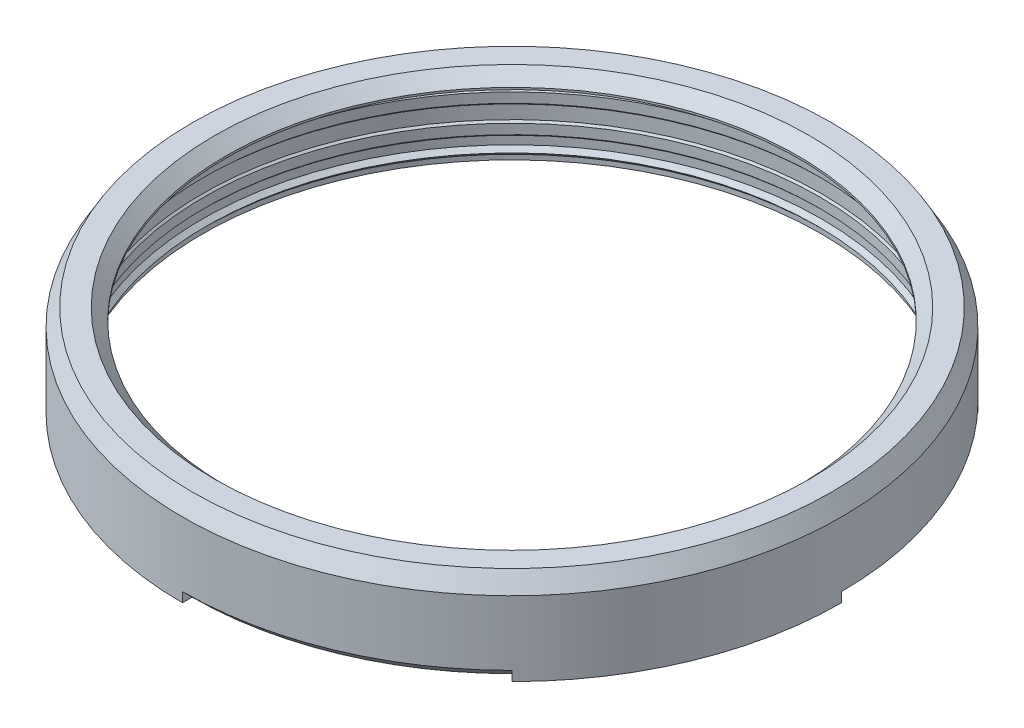
ISO-10303-21;
HEADER;
FILE_DESCRIPTION(('STEP AP214'),'2;1');
FILE_NAME('part.step','',(''),(''),'','','');
FILE_SCHEMA(('AUTOMOTIVE_DESIGN { 1 0 10303 214 1 1 1 1 }'));
ENDSEC;
DATA;
#1=APPLICATION_CONTEXT('core data for automotive mechanical design processes');
#2=APPLICATION_PROTOCOL_DEFINITION('international standard','automotive_design',2000,#1);
#3=PRODUCT_CONTEXT('',#1,'mechanical');
#4=PRODUCT('Part','Part','',(#3));
#5=PRODUCT_RELATED_PRODUCT_CATEGORY('part','',(#4));
#6=PRODUCT_DEFINITION_FORMATION('','',#4);
#7=PRODUCT_DEFINITION_CONTEXT('part definition',#1,'design');
#8=PRODUCT_DEFINITION('design','',#6,#7);
#9=PRODUCT_DEFINITION_SHAPE('','',#8);
#10=(LENGTH_UNIT() NAMED_UNIT(*) SI_UNIT(.MILLI.,.METRE.));
#11=(NAMED_UNIT(*) PLANE_ANGLE_UNIT() SI_UNIT($,.RADIAN.));
#12=(NAMED_UNIT(*) SI_UNIT($,.STERADIAN.) SOLID_ANGLE_UNIT());
#13=UNCERTAINTY_MEASURE_WITH_UNIT(LENGTH_MEASURE(1.E-05),#10,'distance_accuracy_value','');
#14=(GEOMETRIC_REPRESENTATION_CONTEXT(3) GLOBAL_UNCERTAINTY_ASSIGNED_CONTEXT((#13)) GLOBAL_UNIT_ASSIGNED_CONTEXT((#10,
#11,#12)) REPRESENTATION_CONTEXT('',''));
#15=CARTESIAN_POINT('',(0.,0.,0.));
#16=DIRECTION('',(0.,0.,1.));
#17=DIRECTION('',(1.,0.,0.));
#18=AXIS2_PLACEMENT_3D('',#15,#16,#17);
#19=CARTESIAN_POINT('',(0.,-1.39999999999982,0.));
#20=DIRECTION('',(0.,-1.,0.));
#21=DIRECTION('',(0.,0.,-1.));
#22=AXIS2_PLACEMENT_3D('',#19,#20,#21);
#23=TOROIDAL_SURFACE('',#22,30.5300000000001,1.39999999999978);
#24=CARTESIAN_POINT('',(0.,-1.39999999999982,0.));
#25=DIRECTION('',(0.,-1.,0.));
#26=DIRECTION('',(0.,0.,-1.));
#27=AXIS2_PLACEMENT_3D('',#24,#25,#26);
#28=CIRCLE('',#27,31.9299999999999);
#29=CARTESIAN_POINT('',(0.,-1.39999999999982,-31.9299999999999));
#30=VERTEX_POINT('',#29);
#31=EDGE_CURVE('E260',#30,#30,#28,.T.);
#32=ORIENTED_EDGE('',*,*,#31,.T.);
#33=EDGE_LOOP('',(#32));
#34=FACE_BOUND('',#33,.T.);
#35=CARTESIAN_POINT('',(0.,-0.0225022686044193,0.));
#36=DIRECTION('',(0.,-1.,0.));
#37=DIRECTION('',(0.,0.,-1.));
#38=AXIS2_PLACEMENT_3D('',#35,#36,#37);
#39=CIRCLE('',#38,30.78);
#40=CARTESIAN_POINT('',(0.,-0.0225022686044193,-30.78));
#41=VERTEX_POINT('',#40);
#42=EDGE_CURVE('E43',#41,#41,#39,.F.);
#43=ORIENTED_EDGE('',*,*,#42,.T.);
#44=EDGE_LOOP('',(#43));
#45=FACE_BOUND('',#44,.T.);
#46=ADVANCED_FACE('F38',(#34,#45),#23,.F.);
#47=CARTESIAN_POINT('',(0.,0.,0.));
#48=DIRECTION('',(0.,1.,0.));
#49=DIRECTION('',(0.,0.,1.));
#50=AXIS2_PLACEMENT_3D('',#47,#48,#49);
#51=PLANE('',#50);
#52=CARTESIAN_POINT('',(0.,0.,0.));
#53=DIRECTION('',(0.,1.,0.));
#54=DIRECTION('',(0.,0.,1.));
#55=AXIS2_PLACEMENT_3D('',#52,#53,#54);
#56=CIRCLE('',#55,29.5);
#57=CARTESIAN_POINT('',(0.,0.,29.5));
#58=VERTEX_POINT('',#57);
#59=EDGE_CURVE('E218',#58,#58,#56,.T.);
#60=ORIENTED_EDGE('',*,*,#59,.T.);
#61=EDGE_LOOP('',(#60));
#62=FACE_BOUND('',#61,.T.);
#63=CARTESIAN_POINT('',(0.,0.,0.));
#64=DIRECTION('',(0.,-1.,0.));
#65=DIRECTION('',(0.,0.,-1.));
#66=AXIS2_PLACEMENT_3D('',#63,#64,#65);
#67=CIRCLE('',#66,30.32);
#68=CARTESIAN_POINT('',(0.,0.,-30.32));
#69=VERTEX_POINT('',#68);
#70=EDGE_CURVE('E572',#69,#69,#67,.T.);
#71=ORIENTED_EDGE('',*,*,#70,.T.);
#72=EDGE_LOOP('',(#71));
#73=FACE_BOUND('',#72,.T.);
#74=ADVANCED_FACE('F291',(#62,#73),#51,.F.);
#75=CARTESIAN_POINT('',(0.,2.,0.));
#76=DIRECTION('',(0.,-1.,0.));
#77=DIRECTION('',(0.,0.,-1.));
#78=AXIS2_PLACEMENT_3D('',#75,#76,#77);
#79=CYLINDRICAL_SURFACE('',#78,34.);
#80=CARTESIAN_POINT('',(0.,-0.332000000000018,0.));
#81=DIRECTION('',(0.,1.,0.));
#82=DIRECTION('',(0.,0.,1.));
#83=AXIS2_PLACEMENT_3D('',#80,#81,#82);
#84=CIRCLE('',#83,34.);
#85=CARTESIAN_POINT('',(0.,-0.332000000000018,-34.));
#86=VERTEX_POINT('',#85);
#87=EDGE_CURVE('E268',#86,#86,#84,.F.);
#88=ORIENTED_EDGE('',*,*,#87,.T.);
#89=EDGE_LOOP('',(#88));
#90=FACE_BOUND('',#89,.T.);
#91=DIRECTION('',(0.,1.,0.));
#92=VECTOR('',#91,1.);
#93=CARTESIAN_POINT('',(-24.0416305603427,-7.99999999999999,-24.0416305603425));
#94=LINE('',#93,#92);
#95=CARTESIAN_POINT('',(-24.0416305603427,-7.99999999999999,-24.0416305603425));
#96=VERTEX_POINT('',#95);
#97=CARTESIAN_POINT('',(-24.0416305603427,-6.99999999999999,-24.0416305603425));
#98=VERTEX_POINT('',#97);
#99=EDGE_CURVE('E148',#96,#98,#94,.T.);
#100=ORIENTED_EDGE('',*,*,#99,.F.);
#101=CARTESIAN_POINT('',(0.,-7.99999999999999,0.));
#102=DIRECTION('',(0.,-1.,0.));
#103=DIRECTION('',(0.,0.,-1.));
#104=AXIS2_PLACEMENT_3D('',#101,#102,#103);
#105=CIRCLE('',#104,33.9999999999998);
#106=CARTESIAN_POINT('',(-33.9999999999998,-7.99999999999999,0.));
#107=VERTEX_POINT('',#106);
#108=EDGE_CURVE('E323',#107,#96,#105,.T.);
#109=ORIENTED_EDGE('',*,*,#108,.F.);
#110=DIRECTION('',(0.,1.,0.));
#111=VECTOR('',#110,1.);
#112=CARTESIAN_POINT('',(-34.,-7.99999999999999,0.));
#113=LINE('',#112,#111);
#114=CARTESIAN_POINT('',(-34.,-6.99999999999999,0.));
#115=VERTEX_POINT('',#114);
#116=EDGE_CURVE('E63',#107,#115,#113,.T.);
#117=ORIENTED_EDGE('',*,*,#116,.T.);
#118=CARTESIAN_POINT('',(0.,-6.99999999999999,0.));
#119=DIRECTION('',(0.,-1.,0.));
#120=DIRECTION('',(0.,0.,1.));
#121=AXIS2_PLACEMENT_3D('',#118,#119,#120);
#122=CIRCLE('',#121,34.);
#123=CARTESIAN_POINT('',(-24.0416305603426,-6.99999999999999,24.0416305603427));
#124=VERTEX_POINT('',#123);
#125=EDGE_CURVE('E166',#124,#115,#122,.T.);
#126=ORIENTED_EDGE('',*,*,#125,.F.);
#127=DIRECTION('',(0.,1.,0.));
#128=VECTOR('',#127,1.);
#129=CARTESIAN_POINT('',(-24.0416305603426,-7.99999999999999,24.0416305603427));
#130=LINE('',#129,#128);
#131=CARTESIAN_POINT('',(-24.0416305603426,-7.99999999999999,24.0416305603427));
#132=VERTEX_POINT('',#131);
#133=EDGE_CURVE('E134',#132,#124,#130,.T.);
#134=ORIENTED_EDGE('',*,*,#133,.F.);
#135=CARTESIAN_POINT('',(3.56493298585568E-13,-7.99999999999999,33.9999999999998));
#136=VERTEX_POINT('',#135);
#137=EDGE_CURVE('E223',#136,#132,#105,.T.);
#138=ORIENTED_EDGE('',*,*,#137,.F.);
#139=DIRECTION('',(0.,1.,0.));
#140=VECTOR('',#139,1.);
#141=CARTESIAN_POINT('',(3.56131096562E-13,-7.99999999999999,34.));
#142=LINE('',#141,#140);
#143=CARTESIAN_POINT('',(3.56131096562E-13,-6.99999999999999,34.));
#144=VERTEX_POINT('',#143);
#145=EDGE_CURVE('E182',#136,#144,#142,.T.);
#146=ORIENTED_EDGE('',*,*,#145,.T.);
#147=CARTESIAN_POINT('',(0.,-6.99999999999999,0.));
#148=DIRECTION('',(0.,-1.,0.));
#149=DIRECTION('',(1.,0.,0.));
#150=AXIS2_PLACEMENT_3D('',#147,#148,#149);
#151=CIRCLE('',#150,34.);
#152=CARTESIAN_POINT('',(24.0416305603429,-6.99999999999999,24.0416305603423));
#153=VERTEX_POINT('',#152);
#154=EDGE_CURVE('E187',#153,#144,#151,.T.);
#155=ORIENTED_EDGE('',*,*,#154,.F.);
#156=DIRECTION('',(0.,1.,0.));
#157=VECTOR('',#156,1.);
#158=CARTESIAN_POINT('',(24.0416305603429,-7.99999999999999,24.0416305603423));
#159=LINE('',#158,#157);
#160=CARTESIAN_POINT('',(24.0416305603429,-7.99999999999999,24.0416305603423));
#161=VERTEX_POINT('',#160);
#162=EDGE_CURVE('E160',#161,#153,#159,.T.);
#163=ORIENTED_EDGE('',*,*,#162,.F.);
#164=CARTESIAN_POINT('',(33.9999999999998,-7.99999999999999,0.));
#165=VERTEX_POINT('',#164);
#166=EDGE_CURVE('E219',#165,#161,#105,.T.);
#167=ORIENTED_EDGE('',*,*,#166,.F.);
#168=DIRECTION('',(0.,1.,0.));
#169=VECTOR('',#168,1.);
#170=CARTESIAN_POINT('',(34.,-7.99999999999999,0.));
#171=LINE('',#170,#169);
#172=CARTESIAN_POINT('',(34.,-6.99999999999999,0.));
#173=VERTEX_POINT('',#172);
#174=EDGE_CURVE('E199',#165,#173,#171,.T.);
#175=ORIENTED_EDGE('',*,*,#174,.T.);
#176=CARTESIAN_POINT('',(0.,-6.99999999999999,0.));
#177=DIRECTION('',(0.,-1.,0.));
#178=DIRECTION('',(0.,0.,-1.));
#179=AXIS2_PLACEMENT_3D('',#176,#177,#178);
#180=CIRCLE('',#179,34.);
#181=CARTESIAN_POINT('',(24.0416305603426,-6.99999999999999,-24.0416305603427));
#182=VERTEX_POINT('',#181);
#183=EDGE_CURVE('E216',#182,#173,#180,.T.);
#184=ORIENTED_EDGE('',*,*,#183,.F.);
#185=DIRECTION('',(0.,1.,0.));
#186=VECTOR('',#185,1.);
#187=CARTESIAN_POINT('',(24.0416305603426,-7.99999999999999,-24.0416305603427));
#188=LINE('',#187,#186);
#189=CARTESIAN_POINT('',(24.0416305603426,-7.99999999999999,-24.0416305603427));
#190=VERTEX_POINT('',#189);
#191=EDGE_CURVE('E208',#190,#182,#188,.T.);
#192=ORIENTED_EDGE('',*,*,#191,.F.);
#193=CARTESIAN_POINT('',(-1.17433149195491E-13,-7.99999999999999,-33.9999999999998));
#194=VERTEX_POINT('',#193);
#195=EDGE_CURVE('E224',#194,#190,#105,.T.);
#196=ORIENTED_EDGE('',*,*,#195,.F.);
#197=DIRECTION('',(0.,1.,0.));
#198=VECTOR('',#197,1.);
#199=CARTESIAN_POINT('',(-1.18710365520667E-13,-7.99999999999999,-34.));
#200=LINE('',#199,#198);
#201=CARTESIAN_POINT('',(-1.18710365520667E-13,-6.99999999999999,-34.));
#202=VERTEX_POINT('',#201);
#203=EDGE_CURVE('E55',#194,#202,#200,.T.);
#204=ORIENTED_EDGE('',*,*,#203,.T.);
#205=CARTESIAN_POINT('',(0.,-6.99999999999999,0.));
#206=DIRECTION('',(0.,-1.,0.));
#207=DIRECTION('',(-1.,0.,0.));
#208=AXIS2_PLACEMENT_3D('',#205,#206,#207);
#209=CIRCLE('',#208,34.);
#210=EDGE_CURVE('E142',#98,#202,#209,.T.);
#211=ORIENTED_EDGE('',*,*,#210,.F.);
#212=EDGE_LOOP('',(#100,#109,#117,#126,#134,#138,#146,#155,#163,#167,#175,#184,#192,#196,#204,#211));
#213=FACE_BOUND('',#212,.T.);
#214=ADVANCED_FACE('F299',(#90,#213),#79,.T.);
#215=CARTESIAN_POINT('',(16.9999999999999,-7.99999999999999,29.4448637286708));
#216=DIRECTION('',(0.,-1.,0.));
#217=DIRECTION('',(0.,0.,-1.));
#218=AXIS2_PLACEMENT_3D('',#215,#216,#217);
#219=PLANE('',#218);
#220=CARTESIAN_POINT('',(0.,-7.99999999999999,0.));
#221=DIRECTION('',(0.,-1.,0.));
#222=DIRECTION('',(0.,0.,-1.));
#223=AXIS2_PLACEMENT_3D('',#220,#221,#222);
#224=CIRCLE('',#223,31.9299999999999);
#225=CARTESIAN_POINT('',(0.,-7.99999999999999,-31.9299999999999));
#226=VERTEX_POINT('',#225);
#227=EDGE_CURVE('E222',#226,#226,#224,.T.);
#228=ORIENTED_EDGE('',*,*,#227,.F.);
#229=EDGE_LOOP('',(#228));
#230=FACE_BOUND('',#229,.T.);
#231=ORIENTED_EDGE('',*,*,#108,.T.);
#232=DIRECTION('',(-0.707106781186551,0.,-0.707106781186544));
#233=VECTOR('',#232,1.);
#234=CARTESIAN_POINT('',(-23.3345237791562,-7.99999999999999,-23.334523779156));
#235=LINE('',#234,#233);
#236=CARTESIAN_POINT('',(-23.3345237791562,-7.99999999999999,-23.334523779156));
#237=VERTEX_POINT('',#236);
#238=EDGE_CURVE('E146',#237,#96,#235,.T.);
#239=ORIENTED_EDGE('',*,*,#238,.F.);
#240=CARTESIAN_POINT('',(0.,-7.99999999999999,0.));
#241=DIRECTION('',(0.,-1.,0.));
#242=DIRECTION('',(-1.,0.,0.));
#243=AXIS2_PLACEMENT_3D('',#240,#241,#242);
#244=CIRCLE('',#243,33.);
#245=CARTESIAN_POINT('',(-1.15218884181823E-13,-7.99999999999999,-33.));
#246=VERTEX_POINT('',#245);
#247=EDGE_CURVE('E139',#237,#246,#244,.T.);
#248=ORIENTED_EDGE('',*,*,#247,.T.);
#249=DIRECTION('',(0.,0.,-1.));
#250=VECTOR('',#249,1.);
#251=CARTESIAN_POINT('',(-1.15218884181823E-13,-7.99999999999999,-33.));
#252=LINE('',#251,#250);
#253=EDGE_CURVE('E126',#246,#194,#252,.T.);
#254=ORIENTED_EDGE('',*,*,#253,.T.);
#255=ORIENTED_EDGE('',*,*,#195,.T.);
#256=DIRECTION('',(0.707106781186546,0.,-0.707106781186549));
#257=VECTOR('',#256,1.);
#258=CARTESIAN_POINT('',(23.334523779156,-7.99999999999999,-23.3345237791561));
#259=LINE('',#258,#257);
#260=CARTESIAN_POINT('',(23.334523779156,-7.99999999999999,-23.3345237791561));
#261=VERTEX_POINT('',#260);
#262=EDGE_CURVE('E205',#261,#190,#259,.T.);
#263=ORIENTED_EDGE('',*,*,#262,.F.);
#264=CARTESIAN_POINT('',(0.,-7.99999999999999,0.));
#265=DIRECTION('',(0.,-1.,0.));
#266=DIRECTION('',(0.,0.,-1.));
#267=AXIS2_PLACEMENT_3D('',#264,#265,#266);
#268=CIRCLE('',#267,33.);
#269=CARTESIAN_POINT('',(33.,-7.99999999999999,0.));
#270=VERTEX_POINT('',#269);
#271=EDGE_CURVE('E213',#261,#270,#268,.T.);
#272=ORIENTED_EDGE('',*,*,#271,.T.);
#273=DIRECTION('',(1.,0.,0.));
#274=VECTOR('',#273,1.);
#275=CARTESIAN_POINT('',(33.,-7.99999999999999,0.));
#276=LINE('',#275,#274);
#277=EDGE_CURVE('E156',#270,#165,#276,.T.);
#278=ORIENTED_EDGE('',*,*,#277,.T.);
#279=ORIENTED_EDGE('',*,*,#166,.T.);
#280=DIRECTION('',(0.707106781186556,0.,0.707106781186539));
#281=VECTOR('',#280,1.);
#282=CARTESIAN_POINT('',(23.3345237791564,-7.99999999999999,23.3345237791558));
#283=LINE('',#282,#281);
#284=CARTESIAN_POINT('',(23.3345237791564,-7.99999999999999,23.3345237791558));
#285=VERTEX_POINT('',#284);
#286=EDGE_CURVE('E193',#285,#161,#283,.T.);
#287=ORIENTED_EDGE('',*,*,#286,.F.);
#288=CARTESIAN_POINT('',(0.,-7.99999999999999,0.));
#289=DIRECTION('',(0.,-1.,0.));
#290=DIRECTION('',(1.,0.,0.));
#291=AXIS2_PLACEMENT_3D('',#288,#289,#290);
#292=CIRCLE('',#291,33.);
#293=CARTESIAN_POINT('',(3.4565665254547E-13,-7.99999999999999,33.));
#294=VERTEX_POINT('',#293);
#295=EDGE_CURVE('E190',#285,#294,#292,.T.);
#296=ORIENTED_EDGE('',*,*,#295,.T.);
#297=DIRECTION('',(0.,0.,1.));
#298=VECTOR('',#297,1.);
#299=CARTESIAN_POINT('',(3.4565665254547E-13,-7.99999999999999,33.));
#300=LINE('',#299,#298);
#301=EDGE_CURVE('E176',#294,#136,#300,.T.);
#302=ORIENTED_EDGE('',*,*,#301,.T.);
#303=ORIENTED_EDGE('',*,*,#137,.T.);
#304=DIRECTION('',(-0.707106781186546,0.,0.707106781186549));
#305=VECTOR('',#304,1.);
#306=CARTESIAN_POINT('',(-23.334523779156,-7.99999999999999,23.3345237791561));
#307=LINE('',#306,#305);
#308=CARTESIAN_POINT('',(-23.334523779156,-7.99999999999999,23.3345237791561));
#309=VERTEX_POINT('',#308);
#310=EDGE_CURVE('E172',#309,#132,#307,.T.);
#311=ORIENTED_EDGE('',*,*,#310,.F.);
#312=CARTESIAN_POINT('',(0.,-7.99999999999999,0.));
#313=DIRECTION('',(0.,-1.,0.));
#314=DIRECTION('',(0.,0.,1.));
#315=AXIS2_PLACEMENT_3D('',#312,#313,#314);
#316=CIRCLE('',#315,33.);
#317=CARTESIAN_POINT('',(-33.,-7.99999999999999,0.));
#318=VERTEX_POINT('',#317);
#319=EDGE_CURVE('E169',#309,#318,#316,.T.);
#320=ORIENTED_EDGE('',*,*,#319,.T.);
#321=DIRECTION('',(-1.,0.,0.));
#322=VECTOR('',#321,1.);
#323=CARTESIAN_POINT('',(-33.,-7.99999999999999,0.));
#324=LINE('',#323,#322);
#325=EDGE_CURVE('E157',#318,#107,#324,.T.);
#326=ORIENTED_EDGE('',*,*,#325,.T.);
#327=EDGE_LOOP('',(#231,#239,#248,#254,#255,#263,#272,#278,#279,#287,#296,#302,#303,#311,#320,#326));
#328=FACE_BOUND('',#327,.T.);
#329=ADVANCED_FACE('F145',(#230,#328),#219,.T.);
#330=CARTESIAN_POINT('',(0.,-7.99999999999999,0.));
#331=DIRECTION('',(0.,1.,0.));
#332=DIRECTION('',(0.,0.,1.));
#333=AXIS2_PLACEMENT_3D('',#330,#331,#332);
#334=CYLINDRICAL_SURFACE('',#333,29.5);
#335=CARTESIAN_POINT('',(0.,0.199999999999997,0.));
#336=DIRECTION('',(0.,1.,0.));
#337=DIRECTION('',(0.,0.,1.));
#338=AXIS2_PLACEMENT_3D('',#335,#336,#337);
#339=CIRCLE('',#338,29.5);
#340=CARTESIAN_POINT('',(0.,0.199999999999997,29.5));
#341=VERTEX_POINT('',#340);
#342=EDGE_CURVE('E11',#341,#341,#339,.T.);
#343=ORIENTED_EDGE('',*,*,#342,.T.);
#344=EDGE_LOOP('',(#343));
#345=FACE_BOUND('',#344,.T.);
#346=ORIENTED_EDGE('',*,*,#59,.F.);
#347=EDGE_LOOP('',(#346));
#348=FACE_BOUND('',#347,.T.);
#349=ADVANCED_FACE('F316',(#345,#348),#334,.F.);
#350=CARTESIAN_POINT('',(0.,0.,0.));
#351=DIRECTION('',(0.,-1.,0.));
#352=DIRECTION('',(0.,0.,-1.));
#353=AXIS2_PLACEMENT_3D('',#350,#351,#352);
#354=CYLINDRICAL_SURFACE('',#353,31.9299999999999);
#355=CARTESIAN_POINT('',(0.,-1.5999999999996,0.));
#356=DIRECTION('',(0.,-1.,0.));
#357=DIRECTION('',(0.,0.,-1.));
#358=AXIS2_PLACEMENT_3D('',#355,#356,#357);
#359=CIRCLE('',#358,31.9299999999999);
#360=CARTESIAN_POINT('',(0.,-1.5999999999996,-31.9299999999999));
#361=VERTEX_POINT('',#360);
#362=EDGE_CURVE('E257',#361,#361,#359,.T.);
#363=ORIENTED_EDGE('',*,*,#362,.T.);
#364=EDGE_LOOP('',(#363));
#365=FACE_BOUND('',#364,.T.);
#366=ORIENTED_EDGE('',*,*,#31,.F.);
#367=EDGE_LOOP('',(#366));
#368=FACE_BOUND('',#367,.T.);
#369=ADVANCED_FACE('F304',(#365,#368),#354,.F.);
#370=CARTESIAN_POINT('',(0.,-1.5999999999996,0.));
#371=DIRECTION('',(0.,1.,0.));
#372=DIRECTION('',(0.,0.,1.));
#373=AXIS2_PLACEMENT_3D('',#370,#371,#372);
#374=CONICAL_SURFACE('',#373,31.9299999999999,0.785398163397427);
#375=CARTESIAN_POINT('',(0.,-1.78999999999967,0.));
#376=DIRECTION('',(0.,-1.,0.));
#377=DIRECTION('',(0.,0.,-1.));
#378=AXIS2_PLACEMENT_3D('',#375,#376,#377);
#379=CIRCLE('',#378,31.7399999999999);
#380=CARTESIAN_POINT('',(0.,-1.78999999999967,-31.7399999999999));
#381=VERTEX_POINT('',#380);
#382=EDGE_CURVE('E254',#381,#381,#379,.T.);
#383=ORIENTED_EDGE('',*,*,#382,.T.);
#384=EDGE_LOOP('',(#383));
#385=FACE_BOUND('',#384,.T.);
#386=ORIENTED_EDGE('',*,*,#362,.F.);
#387=EDGE_LOOP('',(#386));
#388=FACE_BOUND('',#387,.T.);
#389=ADVANCED_FACE('F421',(#385,#388),#374,.F.);
#390=CARTESIAN_POINT('',(0.,0.,0.));
#391=DIRECTION('',(0.,-1.,0.));
#392=DIRECTION('',(0.,0.,-1.));
#393=AXIS2_PLACEMENT_3D('',#390,#391,#392);
#394=CYLINDRICAL_SURFACE('',#393,31.7399999999999);
#395=CARTESIAN_POINT('',(0.,-2.80999999999968,0.));
#396=DIRECTION('',(0.,-1.,0.));
#397=DIRECTION('',(0.,0.,-1.));
#398=AXIS2_PLACEMENT_3D('',#395,#396,#397);
#399=CIRCLE('',#398,31.7399999999999);
#400=CARTESIAN_POINT('',(0.,-2.80999999999968,-31.7399999999999));
#401=VERTEX_POINT('',#400);
#402=EDGE_CURVE('E251',#401,#401,#399,.T.);
#403=ORIENTED_EDGE('',*,*,#402,.T.);
#404=EDGE_LOOP('',(#403));
#405=FACE_BOUND('',#404,.T.);
#406=ORIENTED_EDGE('',*,*,#382,.F.);
#407=EDGE_LOOP('',(#406));
#408=FACE_BOUND('',#407,.T.);
#409=ADVANCED_FACE('F418',(#405,#408),#394,.F.);
#410=CARTESIAN_POINT('',(0.,-2.80999999999968,0.));
#411=DIRECTION('',(0.,-1.,0.));
#412=DIRECTION('',(0.,0.,-1.));
#413=AXIS2_PLACEMENT_3D('',#410,#411,#412);
#414=CONICAL_SURFACE('',#413,31.7399999999999,0.785398163397503);
#415=CARTESIAN_POINT('',(0.,-2.99999999999972,0.));
#416=DIRECTION('',(0.,-1.,0.));
#417=DIRECTION('',(0.,0.,-1.));
#418=AXIS2_PLACEMENT_3D('',#415,#416,#417);
#419=CIRCLE('',#418,31.9299999999999);
#420=CARTESIAN_POINT('',(0.,-2.99999999999972,-31.9299999999999));
#421=VERTEX_POINT('',#420);
#422=EDGE_CURVE('E248',#421,#421,#419,.T.);
#423=ORIENTED_EDGE('',*,*,#422,.T.);
#424=EDGE_LOOP('',(#423));
#425=FACE_BOUND('',#424,.T.);
#426=ORIENTED_EDGE('',*,*,#402,.F.);
#427=EDGE_LOOP('',(#426));
#428=FACE_BOUND('',#427,.T.);
#429=ADVANCED_FACE('F414',(#425,#428),#414,.F.);
#430=CARTESIAN_POINT('',(0.,0.,0.));
#431=DIRECTION('',(0.,-1.,0.));
#432=DIRECTION('',(0.,0.,-1.));
#433=AXIS2_PLACEMENT_3D('',#430,#431,#432);
#434=CYLINDRICAL_SURFACE('',#433,31.9299999999999);
#435=CARTESIAN_POINT('',(0.,-4.39999999999971,0.));
#436=DIRECTION('',(0.,-1.,0.));
#437=DIRECTION('',(0.,0.,-1.));
#438=AXIS2_PLACEMENT_3D('',#435,#436,#437);
#439=CIRCLE('',#438,31.9299999999999);
#440=CARTESIAN_POINT('',(0.,-4.39999999999971,-31.9299999999999));
#441=VERTEX_POINT('',#440);
#442=EDGE_CURVE('E245',#441,#441,#439,.T.);
#443=ORIENTED_EDGE('',*,*,#442,.T.);
#444=EDGE_LOOP('',(#443));
#445=FACE_BOUND('',#444,.T.);
#446=ORIENTED_EDGE('',*,*,#422,.F.);
#447=EDGE_LOOP('',(#446));
#448=FACE_BOUND('',#447,.T.);
#449=ADVANCED_FACE('F410',(#445,#448),#434,.F.);
#450=CARTESIAN_POINT('',(0.,-4.39999999999971,0.));
#451=DIRECTION('',(0.,1.,0.));
#452=DIRECTION('',(0.,0.,1.));
#453=AXIS2_PLACEMENT_3D('',#450,#451,#452);
#454=CONICAL_SURFACE('',#453,31.9299999999999,0.785398163397396);
#455=CARTESIAN_POINT('',(0.,-4.58999999999978,0.));
#456=DIRECTION('',(0.,-1.,0.));
#457=DIRECTION('',(0.,0.,-1.));
#458=AXIS2_PLACEMENT_3D('',#455,#456,#457);
#459=CIRCLE('',#458,31.7399999999999);
#460=CARTESIAN_POINT('',(0.,-4.58999999999978,-31.7399999999999));
#461=VERTEX_POINT('',#460);
#462=EDGE_CURVE('E242',#461,#461,#459,.T.);
#463=ORIENTED_EDGE('',*,*,#462,.T.);
#464=EDGE_LOOP('',(#463));
#465=FACE_BOUND('',#464,.T.);
#466=ORIENTED_EDGE('',*,*,#442,.F.);
#467=EDGE_LOOP('',(#466));
#468=FACE_BOUND('',#467,.T.);
#469=ADVANCED_FACE('F406',(#465,#468),#454,.F.);
#470=CARTESIAN_POINT('',(0.,0.,0.));
#471=DIRECTION('',(0.,-1.,0.));
#472=DIRECTION('',(0.,0.,-1.));
#473=AXIS2_PLACEMENT_3D('',#470,#471,#472);
#474=CYLINDRICAL_SURFACE('',#473,31.7399999999999);
#475=CARTESIAN_POINT('',(0.,-5.60999999999975,0.));
#476=DIRECTION('',(0.,-1.,0.));
#477=DIRECTION('',(0.,0.,-1.));
#478=AXIS2_PLACEMENT_3D('',#475,#476,#477);
#479=CIRCLE('',#478,31.7399999999999);
#480=CARTESIAN_POINT('',(0.,-5.60999999999975,-31.7399999999999));
#481=VERTEX_POINT('',#480);
#482=EDGE_CURVE('E239',#481,#481,#479,.T.);
#483=ORIENTED_EDGE('',*,*,#482,.T.);
#484=EDGE_LOOP('',(#483));
#485=FACE_BOUND('',#484,.T.);
#486=ORIENTED_EDGE('',*,*,#462,.F.);
#487=EDGE_LOOP('',(#486));
#488=FACE_BOUND('',#487,.T.);
#489=ADVANCED_FACE('F402',(#485,#488),#474,.F.);
#490=CARTESIAN_POINT('',(0.,-5.60999999999975,0.));
#491=DIRECTION('',(0.,-1.,0.));
#492=DIRECTION('',(0.,0.,-1.));
#493=AXIS2_PLACEMENT_3D('',#490,#491,#492);
#494=CONICAL_SURFACE('',#493,31.7399999999999,0.785398163397505);
#495=CARTESIAN_POINT('',(0.,-5.79999999999978,0.));
#496=DIRECTION('',(0.,-1.,0.));
#497=DIRECTION('',(0.,0.,-1.));
#498=AXIS2_PLACEMENT_3D('',#495,#496,#497);
#499=CIRCLE('',#498,31.9299999999999);
#500=CARTESIAN_POINT('',(0.,-5.79999999999978,-31.9299999999999));
#501=VERTEX_POINT('',#500);
#502=EDGE_CURVE('E236',#501,#501,#499,.T.);
#503=ORIENTED_EDGE('',*,*,#502,.T.);
#504=EDGE_LOOP('',(#503));
#505=FACE_BOUND('',#504,.T.);
#506=ORIENTED_EDGE('',*,*,#482,.F.);
#507=EDGE_LOOP('',(#506));
#508=FACE_BOUND('',#507,.T.);
#509=ADVANCED_FACE('F398',(#505,#508),#494,.F.);
#510=CARTESIAN_POINT('',(0.,0.,0.));
#511=DIRECTION('',(0.,-1.,0.));
#512=DIRECTION('',(0.,0.,-1.));
#513=AXIS2_PLACEMENT_3D('',#510,#511,#512);
#514=CYLINDRICAL_SURFACE('',#513,31.9299999999999);
#515=CARTESIAN_POINT('',(0.,-6.64999999999977,0.));
#516=DIRECTION('',(0.,-1.,0.));
#517=DIRECTION('',(0.,0.,-1.));
#518=AXIS2_PLACEMENT_3D('',#515,#516,#517);
#519=CIRCLE('',#518,31.9299999999999);
#520=CARTESIAN_POINT('',(0.,-6.64999999999977,-31.9299999999999));
#521=VERTEX_POINT('',#520);
#522=EDGE_CURVE('E233',#521,#521,#519,.T.);
#523=ORIENTED_EDGE('',*,*,#522,.T.);
#524=EDGE_LOOP('',(#523));
#525=FACE_BOUND('',#524,.T.);
#526=ORIENTED_EDGE('',*,*,#502,.F.);
#527=EDGE_LOOP('',(#526));
#528=FACE_BOUND('',#527,.T.);
#529=ADVANCED_FACE('F394',(#525,#528),#514,.F.);
#530=CARTESIAN_POINT('',(0.,-6.64999999999977,0.));
#531=DIRECTION('',(0.,1.,0.));
#532=DIRECTION('',(0.,0.,1.));
#533=AXIS2_PLACEMENT_3D('',#530,#531,#532);
#534=CONICAL_SURFACE('',#533,31.9299999999999,0.785398163397383);
#535=CARTESIAN_POINT('',(0.,-7.07499999999994,0.));
#536=DIRECTION('',(0.,-1.,0.));
#537=DIRECTION('',(0.,0.,-1.));
#538=AXIS2_PLACEMENT_3D('',#535,#536,#537);
#539=CIRCLE('',#538,31.5049999999998);
#540=CARTESIAN_POINT('',(0.,-7.07499999999994,-31.5049999999998));
#541=VERTEX_POINT('',#540);
#542=EDGE_CURVE('E230',#541,#541,#539,.T.);
#543=ORIENTED_EDGE('',*,*,#542,.T.);
#544=EDGE_LOOP('',(#543));
#545=FACE_BOUND('',#544,.T.);
#546=ORIENTED_EDGE('',*,*,#522,.F.);
#547=EDGE_LOOP('',(#546));
#548=FACE_BOUND('',#547,.T.);
#549=ADVANCED_FACE('F390',(#545,#548),#534,.F.);
#550=CARTESIAN_POINT('',(0.,-7.07499999999994,0.));
#551=DIRECTION('',(0.,-1.,0.));
#552=DIRECTION('',(0.,0.,-1.));
#553=AXIS2_PLACEMENT_3D('',#550,#551,#552);
#554=CONICAL_SURFACE('',#553,31.5049999999998,0.785398163397522);
#555=CARTESIAN_POINT('',(0.,-7.49999999999998,0.));
#556=DIRECTION('',(0.,-1.,0.));
#557=DIRECTION('',(0.,0.,-1.));
#558=AXIS2_PLACEMENT_3D('',#555,#556,#557);
#559=CIRCLE('',#558,31.9299999999999);
#560=CARTESIAN_POINT('',(0.,-7.49999999999998,-31.9299999999999));
#561=VERTEX_POINT('',#560);
#562=EDGE_CURVE('E227',#561,#561,#559,.T.);
#563=ORIENTED_EDGE('',*,*,#562,.T.);
#564=EDGE_LOOP('',(#563));
#565=FACE_BOUND('',#564,.T.);
#566=ORIENTED_EDGE('',*,*,#542,.F.);
#567=EDGE_LOOP('',(#566));
#568=FACE_BOUND('',#567,.T.);
#569=ADVANCED_FACE('F386',(#565,#568),#554,.F.);
#570=CARTESIAN_POINT('',(0.,0.,0.));
#571=DIRECTION('',(0.,-1.,0.));
#572=DIRECTION('',(0.,0.,-1.));
#573=AXIS2_PLACEMENT_3D('',#570,#571,#572);
#574=CYLINDRICAL_SURFACE('',#573,31.9299999999999);
#575=ORIENTED_EDGE('',*,*,#227,.T.);
#576=EDGE_LOOP('',(#575));
#577=FACE_BOUND('',#576,.T.);
#578=ORIENTED_EDGE('',*,*,#562,.F.);
#579=EDGE_LOOP('',(#578));
#580=FACE_BOUND('',#579,.T.);
#581=ADVANCED_FACE('F380',(#577,#580),#574,.F.);
#582=CARTESIAN_POINT('',(0.,1.4,0.));
#583=DIRECTION('',(0.,1.,0.));
#584=DIRECTION('',(0.,0.,1.));
#585=AXIS2_PLACEMENT_3D('',#582,#583,#584);
#586=PLANE('',#585);
#587=CARTESIAN_POINT('',(0.,1.4,0.));
#588=DIRECTION('',(0.,1.,0.));
#589=DIRECTION('',(0.,0.,1.));
#590=AXIS2_PLACEMENT_3D('',#587,#588,#589);
#591=CIRCLE('',#590,30.7);
#592=CARTESIAN_POINT('',(0.,1.4,30.7));
#593=VERTEX_POINT('',#592);
#594=EDGE_CURVE('E48',#593,#593,#591,.F.);
#595=ORIENTED_EDGE('',*,*,#594,.T.);
#596=EDGE_LOOP('',(#595));
#597=FACE_BOUND('',#596,.T.);
#598=CARTESIAN_POINT('',(0.,1.4,0.));
#599=DIRECTION('',(0.,1.,0.));
#600=DIRECTION('',(0.,0.,1.));
#601=AXIS2_PLACEMENT_3D('',#598,#599,#600);
#602=CIRCLE('',#601,33.0000293337636);
#603=CARTESIAN_POINT('',(0.,1.4,-33.0000293337636));
#604=VERTEX_POINT('',#603);
#605=EDGE_CURVE('E263',#604,#604,#602,.T.);
#606=ORIENTED_EDGE('',*,*,#605,.T.);
#607=EDGE_LOOP('',(#606));
#608=FACE_BOUND('',#607,.T.);
#609=ADVANCED_FACE('F274',(#597,#608),#586,.T.);
#610=CARTESIAN_POINT('',(0.,1.4,0.));
#611=DIRECTION('',(0.,-1.,0.));
#612=DIRECTION('',(0.,0.,-1.));
#613=AXIS2_PLACEMENT_3D('',#610,#611,#612);
#614=CONICAL_SURFACE('',#613,33.0000293337636,0.523598775598296);
#615=CARTESIAN_POINT('',(0.,-0.332000000000018,-34.));
#616=CARTESIAN_POINT('',(0.,-0.313958333333351,-33.9895836388934));
#617=CARTESIAN_POINT('',(0.,-0.295916666666684,-33.9791672777867));
#618=CARTESIAN_POINT('',(0.,-0.259833333333351,-33.9583345555735));
#619=CARTESIAN_POINT('',(0.,-0.241791666666685,-33.9479181944669));
#620=CARTESIAN_POINT('',(0.,-0.205708333333351,-33.9270854722536));
#621=CARTESIAN_POINT('',(0.,-0.187666666666683,-33.916669111147));
#622=CARTESIAN_POINT('',(0.,-0.151583333333349,-33.8958363889337));
#623=CARTESIAN_POINT('',(0.,-0.133541666666683,-33.8854200278271));
#624=CARTESIAN_POINT('',(0.,-0.0974583333333493,-33.8645873056138));
#625=CARTESIAN_POINT('',(0.,-0.0794166666666823,-33.8541709445072));
#626=CARTESIAN_POINT('',(0.,-0.0433333333333485,-33.8333382222939));
#627=CARTESIAN_POINT('',(0.,-0.0252916666666817,-33.8229218611873));
#628=CARTESIAN_POINT('',(0.,0.010791666666652,-33.802089138974));
#629=CARTESIAN_POINT('',(0.,0.0288333333333188,-33.7916727778674));
#630=CARTESIAN_POINT('',(0.,0.0649166666666526,-33.7708400556542));
#631=CARTESIAN_POINT('',(0.,0.0829583333333196,-33.7604236945475));
#632=CARTESIAN_POINT('',(0.,0.119041666666653,-33.7395909723343));
#633=CARTESIAN_POINT('',(0.,0.137083333333319,-33.7291746112276));
#634=CARTESIAN_POINT('',(0.,0.173166666666653,-33.7083418890144));
#635=CARTESIAN_POINT('',(0.,0.191208333333321,-33.6979255279077));
#636=CARTESIAN_POINT('',(0.,0.227291666666655,-33.6770928056945));
#637=CARTESIAN_POINT('',(0.,0.245333333333321,-33.6666764445879));
#638=CARTESIAN_POINT('',(0.,0.281416666666655,-33.6458437223746));
#639=CARTESIAN_POINT('',(0.,0.299458333333322,-33.635427361268));
#640=CARTESIAN_POINT('',(0.,0.335541666666656,-33.6145946390547));
#641=CARTESIAN_POINT('',(0.,0.353583333333322,-33.6041782779481));
#642=CARTESIAN_POINT('',(0.,0.389666666666656,-33.5833455557348));
#643=CARTESIAN_POINT('',(0.,0.407708333333323,-33.5729291946282));
#644=CARTESIAN_POINT('',(0.,0.443791666666656,-33.5520964724149));
#645=CARTESIAN_POINT('',(0.,0.461833333333323,-33.5416801113083));
#646=CARTESIAN_POINT('',(0.,0.497916666666657,-33.520847389095));
#647=CARTESIAN_POINT('',(0.,0.515958333333324,-33.5104310279884));
#648=CARTESIAN_POINT('',(0.,0.552041666666658,-33.4895983057752));
#649=CARTESIAN_POINT('',(0.,0.570083333333325,-33.4791819446685));
#650=CARTESIAN_POINT('',(0.,0.606166666666658,-33.4583492224553));
#651=CARTESIAN_POINT('',(0.,0.624208333333325,-33.4479328613486));
#652=CARTESIAN_POINT('',(0.,0.660291666666659,-33.4271001391354));
#653=CARTESIAN_POINT('',(0.,0.678333333333326,-33.4166837780287));
#654=CARTESIAN_POINT('',(0.,0.714416666666659,-33.3958510558155));
#655=CARTESIAN_POINT('',(0.,0.732458333333326,-33.3854346947089));
#656=CARTESIAN_POINT('',(0.,0.76854166666666,-33.3646019724956));
#657=CARTESIAN_POINT('',(0.,0.786583333333327,-33.354185611389));
#658=CARTESIAN_POINT('',(0.,0.82266666666666,-33.3333528891757));
#659=CARTESIAN_POINT('',(0.,0.840708333333327,-33.3229365280691));
#660=CARTESIAN_POINT('',(0.,0.876791666666661,-33.3021038058558));
#661=CARTESIAN_POINT('',(0.,0.894833333333328,-33.2916874447492));
#662=CARTESIAN_POINT('',(0.,0.930916666666662,-33.2708547225359));
#663=CARTESIAN_POINT('',(0.,0.948958333333329,-33.2604383614293));
#664=CARTESIAN_POINT('',(0.,0.985041666666662,-33.239605639216));
#665=CARTESIAN_POINT('',(0.,1.00308333333333,-33.2291892781094));
#666=CARTESIAN_POINT('',(0.,1.03916666666666,-33.2083565558962));
#667=CARTESIAN_POINT('',(0.,1.05720833333333,-33.1979401947895));
#668=CARTESIAN_POINT('',(0.,1.09329166666666,-33.1771074725763));
#669=CARTESIAN_POINT('',(0.,1.11133333333333,-33.1666911114696));
#670=CARTESIAN_POINT('',(0.,1.14741666666666,-33.1458583892564));
#671=CARTESIAN_POINT('',(0.,1.16545833333333,-33.1354420281497));
#672=CARTESIAN_POINT('',(0.,1.20154166666666,-33.1146093059365));
#673=CARTESIAN_POINT('',(0.,1.21958333333333,-33.1041929448299));
#674=CARTESIAN_POINT('',(0.,1.25566666666667,-33.0833602226166));
#675=CARTESIAN_POINT('',(0.,1.27370833333333,-33.07294386151));
#676=CARTESIAN_POINT('',(0.,1.30979166666667,-33.0521111392967));
#677=CARTESIAN_POINT('',(0.,1.32783333333333,-33.0416947781901));
#678=CARTESIAN_POINT('',(0.,1.36391666666667,-33.0208620559768));
#679=CARTESIAN_POINT('',(0.,1.38195833333333,-33.0104456948702));
#680=CARTESIAN_POINT('',(0.,1.4,-33.0000293337636));
#681=B_SPLINE_CURVE_WITH_KNOTS('',3,(#615,#616,#617,#618,#619,#620,#621,#622,#623,#624,#625,
#626,#627,#628,#629,#630,#631,#632,#633,#634,#635,#636,#637,#638,#639,#640,#641,#642,#643,#644,
#645,#646,#647,#648,#649,#650,#651,#652,#653,#654,#655,#656,#657,#658,#659,#660,#661,#662,#663,
#664,#665,#666,#667,#668,#669,#670,#671,#672,#673,#674,#675,#676,#677,#678,#679,#680),
.UNSPECIFIED.,.F.,.F.,(4,2,2,2,2,2,2,2,2,2,2,2,2,2,2,2,2,2,2,2,2,2,2,2,2,2,2,2,2,2,2,2,4),(0.,
0.0624981666397781,0.124996333279556,0.187494499919331,0.249992666559109,0.312490833198887,
0.374988999838665,0.437487166478443,0.499985333118221,0.562483499757999,0.624981666397774,
0.687479833037552,0.74997799967733,0.812476166317109,0.874974332956887,0.937472499596665,
0.999970666236439,1.06246883287622,1.124966999516,1.18746516615577,1.24996333279555,
1.31246149943533,1.37495966607511,1.43745783271488,1.49995599935466,1.56245416599444,
1.62495233263422,1.687450499274,1.74994866591377,1.81244683255355,1.87494499919333,
1.9374431658331,1.99994133247288),.UNSPECIFIED.);
#682=EDGE_CURVE('BSEAM279',#86,#604,#681,.T.);
#683=ORIENTED_EDGE('',*,*,#87,.F.);
#684=ORIENTED_EDGE('',*,*,#605,.F.);
#685=ORIENTED_EDGE('',*,*,#682,.T.);
#686=ORIENTED_EDGE('',*,*,#682,.F.);
#687=EDGE_LOOP('',(#683,#685,#684,#686));
#688=FACE_BOUND('',#687,.T.);
#689=ADVANCED_FACE('F279',(#688),#614,.T.);
#690=CARTESIAN_POINT('',(0.,1.4,0.));
#691=DIRECTION('',(0.,1.,0.));
#692=DIRECTION('',(0.,0.,1.));
#693=AXIS2_PLACEMENT_3D('',#690,#691,#692);
#694=CONICAL_SURFACE('',#693,30.7,0.785398163397448);
#695=CARTESIAN_POINT('',(0.,0.199999999999997,29.5));
#696=CARTESIAN_POINT('',(0.,0.212499999999997,29.5125));
#697=CARTESIAN_POINT('',(0.,0.224999999999997,29.525));
#698=CARTESIAN_POINT('',(0.,0.249999999999997,29.55));
#699=CARTESIAN_POINT('',(0.,0.262499999999997,29.5625));
#700=CARTESIAN_POINT('',(0.,0.287499999999997,29.5875));
#701=CARTESIAN_POINT('',(0.,0.299999999999997,29.6));
#702=CARTESIAN_POINT('',(0.,0.324999999999997,29.625));
#703=CARTESIAN_POINT('',(0.,0.337499999999997,29.6375));
#704=CARTESIAN_POINT('',(0.,0.362499999999997,29.6625));
#705=CARTESIAN_POINT('',(0.,0.374999999999997,29.675));
#706=CARTESIAN_POINT('',(0.,0.399999999999997,29.7));
#707=CARTESIAN_POINT('',(0.,0.412499999999997,29.7125));
#708=CARTESIAN_POINT('',(0.,0.437499999999997,29.7375));
#709=CARTESIAN_POINT('',(0.,0.449999999999998,29.75));
#710=CARTESIAN_POINT('',(0.,0.474999999999998,29.775));
#711=CARTESIAN_POINT('',(0.,0.487499999999997,29.7875));
#712=CARTESIAN_POINT('',(0.,0.512499999999997,29.8125));
#713=CARTESIAN_POINT('',(0.,0.524999999999998,29.825));
#714=CARTESIAN_POINT('',(0.,0.549999999999998,29.85));
#715=CARTESIAN_POINT('',(0.,0.562499999999998,29.8625));
#716=CARTESIAN_POINT('',(0.,0.587499999999998,29.8875));
#717=CARTESIAN_POINT('',(0.,0.599999999999998,29.9));
#718=CARTESIAN_POINT('',(0.,0.624999999999998,29.925));
#719=CARTESIAN_POINT('',(0.,0.637499999999998,29.9375));
#720=CARTESIAN_POINT('',(0.,0.662499999999998,29.9625));
#721=CARTESIAN_POINT('',(0.,0.674999999999998,29.975));
#722=CARTESIAN_POINT('',(0.,0.699999999999998,30.));
#723=CARTESIAN_POINT('',(0.,0.712499999999998,30.0125));
#724=CARTESIAN_POINT('',(0.,0.737499999999998,30.0375));
#725=CARTESIAN_POINT('',(0.,0.749999999999998,30.05));
#726=CARTESIAN_POINT('',(0.,0.774999999999998,30.075));
#727=CARTESIAN_POINT('',(0.,0.787499999999999,30.0875));
#728=CARTESIAN_POINT('',(0.,0.812499999999999,30.1125));
#729=CARTESIAN_POINT('',(0.,0.824999999999998,30.125));
#730=CARTESIAN_POINT('',(0.,0.849999999999998,30.15));
#731=CARTESIAN_POINT('',(0.,0.862499999999998,30.1625));
#732=CARTESIAN_POINT('',(0.,0.887499999999999,30.1875));
#733=CARTESIAN_POINT('',(0.,0.899999999999998,30.2));
#734=CARTESIAN_POINT('',(0.,0.924999999999999,30.225));
#735=CARTESIAN_POINT('',(0.,0.937499999999999,30.2375));
#736=CARTESIAN_POINT('',(0.,0.962499999999999,30.2625));
#737=CARTESIAN_POINT('',(0.,0.974999999999999,30.275));
#738=CARTESIAN_POINT('',(0.,0.999999999999999,30.3));
#739=CARTESIAN_POINT('',(0.,1.0125,30.3125));
#740=CARTESIAN_POINT('',(0.,1.0375,30.3375));
#741=CARTESIAN_POINT('',(0.,1.05,30.35));
#742=CARTESIAN_POINT('',(0.,1.075,30.375));
#743=CARTESIAN_POINT('',(0.,1.0875,30.3875));
#744=CARTESIAN_POINT('',(0.,1.1125,30.4125));
#745=CARTESIAN_POINT('',(0.,1.125,30.425));
#746=CARTESIAN_POINT('',(0.,1.15,30.45));
#747=CARTESIAN_POINT('',(0.,1.1625,30.4625));
#748=CARTESIAN_POINT('',(0.,1.1875,30.4875));
#749=CARTESIAN_POINT('',(0.,1.2,30.5));
#750=CARTESIAN_POINT('',(0.,1.225,30.525));
#751=CARTESIAN_POINT('',(0.,1.2375,30.5375));
#752=CARTESIAN_POINT('',(0.,1.2625,30.5625));
#753=CARTESIAN_POINT('',(0.,1.275,30.575));
#754=CARTESIAN_POINT('',(0.,1.3,30.6));
#755=CARTESIAN_POINT('',(0.,1.3125,30.6125));
#756=CARTESIAN_POINT('',(0.,1.3375,30.6375));
#757=CARTESIAN_POINT('',(0.,1.35,30.65));
#758=CARTESIAN_POINT('',(0.,1.375,30.675));
#759=CARTESIAN_POINT('',(0.,1.3875,30.6875));
#760=CARTESIAN_POINT('',(0.,1.4,30.7));
#761=B_SPLINE_CURVE_WITH_KNOTS('',3,(#695,#696,#697,#698,#699,#700,#701,#702,#703,#704,#705,
#706,#707,#708,#709,#710,#711,#712,#713,#714,#715,#716,#717,#718,#719,#720,#721,#722,#723,#724,
#725,#726,#727,#728,#729,#730,#731,#732,#733,#734,#735,#736,#737,#738,#739,#740,#741,#742,#743,
#744,#745,#746,#747,#748,#749,#750,#751,#752,#753,#754,#755,#756,#757,#758,#759,#760),
.UNSPECIFIED.,.F.,.F.,(4,2,2,2,2,2,2,2,2,2,2,2,2,2,2,2,2,2,2,2,2,2,2,2,2,2,2,2,2,2,2,2,4),(0.,
0.0530330085889907,0.106066017177981,0.159099025766975,0.212132034355965,0.265165042944956,
0.318198051533946,0.371231060122937,0.42426406871193,0.477297077300921,0.530330085889912,
0.583363094478902,0.636396103067895,0.689429111656886,0.742462120245877,0.795495128834868,
0.848528137423858,0.901561146012851,0.954594154601842,1.00762716319083,1.06066017177982,
1.11369318036882,1.16672618895781,1.2197591975468,1.27279220613579,1.32582521472478,
1.37885822331377,1.43189123190276,1.48492424049175,1.53795724908074,1.59099025766973,
1.64402326625873,1.69705627484772),.UNSPECIFIED.);
#762=EDGE_CURVE('BSEAM41',#341,#593,#761,.T.);
#763=ORIENTED_EDGE('',*,*,#342,.F.);
#764=ORIENTED_EDGE('',*,*,#594,.F.);
#765=ORIENTED_EDGE('',*,*,#762,.T.);
#766=ORIENTED_EDGE('',*,*,#762,.F.);
#767=EDGE_LOOP('',(#763,#765,#764,#766));
#768=FACE_BOUND('',#767,.T.);
#769=ADVANCED_FACE('F41',(#768),#694,.F.);
#770=CARTESIAN_POINT('',(0.,-6.99999999999999,0.));
#771=DIRECTION('',(0.,1.,0.));
#772=DIRECTION('',(0.,0.,1.));
#773=AXIS2_PLACEMENT_3D('',#770,#771,#772);
#774=CONICAL_SURFACE('',#773,34.,0.78539816339745);
#775=DIRECTION('',(-0.5,-0.707106781186547,0.500000000000002));
#776=VECTOR('',#775,1.);
#777=CARTESIAN_POINT('',(24.0416305603426,-6.99999999999999,-24.0416305603427));
#778=LINE('',#777,#776);
#779=EDGE_CURVE('E210',#182,#261,#778,.T.);
#780=ORIENTED_EDGE('',*,*,#779,.F.);
#781=ORIENTED_EDGE('',*,*,#183,.T.);
#782=DIRECTION('',(-0.707106781186548,-0.707106781186547,0.));
#783=VECTOR('',#782,1.);
#784=CARTESIAN_POINT('',(34.,-6.99999999999999,0.));
#785=LINE('',#784,#783);
#786=EDGE_CURVE('E202',#173,#270,#785,.T.);
#787=ORIENTED_EDGE('',*,*,#786,.T.);
#788=ORIENTED_EDGE('',*,*,#271,.F.);
#789=EDGE_LOOP('',(#780,#781,#787,#788));
#790=FACE_BOUND('',#789,.T.);
#791=ADVANCED_FACE('F278',(#790),#774,.T.);
#792=CARTESIAN_POINT('',(0.,0.,0.));
#793=DIRECTION('',(0.707106781186549,0.,0.707106781186546));
#794=DIRECTION('',(0.707106781186546,0.,-0.707106781186549));
#795=AXIS2_PLACEMENT_3D('',#792,#793,#794);
#796=PLANE('',#795);
#797=ORIENTED_EDGE('',*,*,#262,.T.);
#798=ORIENTED_EDGE('',*,*,#191,.T.);
#799=ORIENTED_EDGE('',*,*,#779,.T.);
#800=EDGE_LOOP('',(#797,#798,#799));
#801=FACE_BOUND('',#800,.T.);
#802=ADVANCED_FACE('F285',(#801),#796,.T.);
#803=CARTESIAN_POINT('',(0.,0.,0.));
#804=DIRECTION('',(0.,0.,1.));
#805=DIRECTION('',(1.,0.,0.));
#806=AXIS2_PLACEMENT_3D('',#803,#804,#805);
#807=PLANE('',#806);
#808=ORIENTED_EDGE('',*,*,#277,.F.);
#809=ORIENTED_EDGE('',*,*,#786,.F.);
#810=ORIENTED_EDGE('',*,*,#174,.F.);
#811=EDGE_LOOP('',(#808,#809,#810));
#812=FACE_BOUND('',#811,.T.);
#813=ADVANCED_FACE('F334',(#812),#807,.F.);
#814=CARTESIAN_POINT('',(0.,0.,0.));
#815=DIRECTION('',(-0.707106781186539,0.,0.707106781186556));
#816=DIRECTION('',(0.707106781186556,0.,0.707106781186539));
#817=AXIS2_PLACEMENT_3D('',#814,#815,#816);
#818=PLANE('',#817);
#819=ORIENTED_EDGE('',*,*,#286,.T.);
#820=ORIENTED_EDGE('',*,*,#162,.T.);
#821=DIRECTION('',(-0.500000000000007,-0.707106781186547,-0.499999999999995));
#822=VECTOR('',#821,1.);
#823=CARTESIAN_POINT('',(24.0416305603429,-6.99999999999999,24.0416305603423));
#824=LINE('',#823,#822);
#825=EDGE_CURVE('E185',#153,#285,#824,.T.);
#826=ORIENTED_EDGE('',*,*,#825,.T.);
#827=EDGE_LOOP('',(#819,#820,#826));
#828=FACE_BOUND('',#827,.T.);
#829=ADVANCED_FACE('F339',(#828),#818,.T.);
#830=CARTESIAN_POINT('',(0.,-6.99999999999999,0.));
#831=DIRECTION('',(0.,1.,0.));
#832=DIRECTION('',(-1.,0.,0.));
#833=AXIS2_PLACEMENT_3D('',#830,#831,#832);
#834=CONICAL_SURFACE('',#833,34.,0.78539816339745);
#835=ORIENTED_EDGE('',*,*,#825,.F.);
#836=ORIENTED_EDGE('',*,*,#154,.T.);
#837=DIRECTION('',(0.,-0.707106781186547,-0.707106781186548));
#838=VECTOR('',#837,1.);
#839=CARTESIAN_POINT('',(3.56131096562E-13,-6.99999999999999,34.));
#840=LINE('',#839,#838);
#841=EDGE_CURVE('E179',#144,#294,#840,.T.);
#842=ORIENTED_EDGE('',*,*,#841,.T.);
#843=ORIENTED_EDGE('',*,*,#295,.F.);
#844=EDGE_LOOP('',(#835,#836,#842,#843));
#845=FACE_BOUND('',#844,.T.);
#846=ADVANCED_FACE('F343',(#845),#834,.T.);
#847=CARTESIAN_POINT('',(0.,0.,0.));
#848=DIRECTION('',(-1.,0.,0.));
#849=DIRECTION('',(0.,0.,1.));
#850=AXIS2_PLACEMENT_3D('',#847,#848,#849);
#851=PLANE('',#850);
#852=ORIENTED_EDGE('',*,*,#301,.F.);
#853=ORIENTED_EDGE('',*,*,#841,.F.);
#854=ORIENTED_EDGE('',*,*,#145,.F.);
#855=EDGE_LOOP('',(#852,#853,#854));
#856=FACE_BOUND('',#855,.T.);
#857=ADVANCED_FACE('F345',(#856),#851,.F.);
#858=CARTESIAN_POINT('',(0.,0.,0.));
#859=DIRECTION('',(-0.707106781186549,0.,-0.707106781186546));
#860=DIRECTION('',(-0.707106781186546,0.,0.707106781186549));
#861=AXIS2_PLACEMENT_3D('',#858,#859,#860);
#862=PLANE('',#861);
#863=ORIENTED_EDGE('',*,*,#310,.T.);
#864=ORIENTED_EDGE('',*,*,#133,.T.);
#865=DIRECTION('',(0.5,-0.707106781186547,-0.500000000000002));
#866=VECTOR('',#865,1.);
#867=CARTESIAN_POINT('',(-24.0416305603426,-6.99999999999999,24.0416305603427));
#868=LINE('',#867,#866);
#869=EDGE_CURVE('E164',#124,#309,#868,.T.);
#870=ORIENTED_EDGE('',*,*,#869,.T.);
#871=EDGE_LOOP('',(#863,#864,#870));
#872=FACE_BOUND('',#871,.T.);
#873=ADVANCED_FACE('F351',(#872),#862,.T.);
#874=CARTESIAN_POINT('',(0.,-6.99999999999999,0.));
#875=DIRECTION('',(0.,1.,0.));
#876=DIRECTION('',(0.,0.,-1.));
#877=AXIS2_PLACEMENT_3D('',#874,#875,#876);
#878=CONICAL_SURFACE('',#877,34.,0.78539816339745);
#879=ORIENTED_EDGE('',*,*,#869,.F.);
#880=ORIENTED_EDGE('',*,*,#125,.T.);
#881=DIRECTION('',(0.707106781186548,-0.707106781186547,0.));
#882=VECTOR('',#881,1.);
#883=CARTESIAN_POINT('',(-34.,-6.99999999999999,0.));
#884=LINE('',#883,#882);
#885=EDGE_CURVE('E159',#115,#318,#884,.T.);
#886=ORIENTED_EDGE('',*,*,#885,.T.);
#887=ORIENTED_EDGE('',*,*,#319,.F.);
#888=EDGE_LOOP('',(#879,#880,#886,#887));
#889=FACE_BOUND('',#888,.T.);
#890=ADVANCED_FACE('F353',(#889),#878,.T.);
#891=CARTESIAN_POINT('',(0.,0.,0.));
#892=DIRECTION('',(0.,0.,-1.));
#893=DIRECTION('',(-1.,0.,0.));
#894=AXIS2_PLACEMENT_3D('',#891,#892,#893);
#895=PLANE('',#894);
#896=ORIENTED_EDGE('',*,*,#325,.F.);
#897=ORIENTED_EDGE('',*,*,#885,.F.);
#898=ORIENTED_EDGE('',*,*,#116,.F.);
#899=EDGE_LOOP('',(#896,#897,#898));
#900=FACE_BOUND('',#899,.T.);
#901=ADVANCED_FACE('F354',(#900),#895,.F.);
#902=CARTESIAN_POINT('',(0.,0.,0.));
#903=DIRECTION('',(0.707106781186544,0.,-0.707106781186551));
#904=DIRECTION('',(-0.707106781186551,0.,-0.707106781186544));
#905=AXIS2_PLACEMENT_3D('',#902,#903,#904);
#906=PLANE('',#905);
#907=ORIENTED_EDGE('',*,*,#238,.T.);
#908=ORIENTED_EDGE('',*,*,#99,.T.);
#909=DIRECTION('',(0.500000000000003,-0.707106781186547,0.499999999999998));
#910=VECTOR('',#909,1.);
#911=CARTESIAN_POINT('',(-24.0416305603427,-6.99999999999999,-24.0416305603425));
#912=LINE('',#911,#910);
#913=EDGE_CURVE('E150',#98,#237,#912,.T.);
#914=ORIENTED_EDGE('',*,*,#913,.T.);
#915=EDGE_LOOP('',(#907,#908,#914));
#916=FACE_BOUND('',#915,.T.);
#917=ADVANCED_FACE('F356',(#916),#906,.T.);
#918=CARTESIAN_POINT('',(0.,-6.99999999999999,0.));
#919=DIRECTION('',(0.,1.,0.));
#920=DIRECTION('',(1.,0.,0.));
#921=AXIS2_PLACEMENT_3D('',#918,#919,#920);
#922=CONICAL_SURFACE('',#921,34.,0.78539816339745);
#923=ORIENTED_EDGE('',*,*,#913,.F.);
#924=ORIENTED_EDGE('',*,*,#210,.T.);
#925=DIRECTION('',(0.,-0.707106781186547,0.707106781186548));
#926=VECTOR('',#925,1.);
#927=CARTESIAN_POINT('',(-1.18710365520667E-13,-6.99999999999999,-34.));
#928=LINE('',#927,#926);
#929=EDGE_CURVE('E129',#202,#246,#928,.T.);
#930=ORIENTED_EDGE('',*,*,#929,.T.);
#931=ORIENTED_EDGE('',*,*,#247,.F.);
#932=EDGE_LOOP('',(#923,#924,#930,#931));
#933=FACE_BOUND('',#932,.T.);
#934=ADVANCED_FACE('F138',(#933),#922,.T.);
#935=CARTESIAN_POINT('',(0.,0.,0.));
#936=DIRECTION('',(1.,0.,0.));
#937=DIRECTION('',(0.,0.,-1.));
#938=AXIS2_PLACEMENT_3D('',#935,#936,#937);
#939=PLANE('',#938);
#940=ORIENTED_EDGE('',*,*,#253,.F.);
#941=ORIENTED_EDGE('',*,*,#929,.F.);
#942=ORIENTED_EDGE('',*,*,#203,.F.);
#943=EDGE_LOOP('',(#940,#941,#942));
#944=FACE_BOUND('',#943,.T.);
#945=ADVANCED_FACE('F128',(#944),#939,.F.);
#946=CARTESIAN_POINT('',(0.,-0.5,0.));
#947=DIRECTION('',(0.,-1.,0.));
#948=DIRECTION('',(0.,0.,-1.));
#949=AXIS2_PLACEMENT_3D('',#946,#947,#948);
#950=PLANE('',#949);
#951=CARTESIAN_POINT('',(0.,-0.5,0.));
#952=DIRECTION('',(0.,-1.,0.));
#953=DIRECTION('',(0.,0.,-1.));
#954=AXIS2_PLACEMENT_3D('',#951,#952,#953);
#955=CIRCLE('',#954,30.78);
#956=CARTESIAN_POINT('',(0.,-0.5,-30.78));
#957=VERTEX_POINT('',#956);
#958=EDGE_CURVE('E575',#957,#957,#955,.T.);
#959=ORIENTED_EDGE('',*,*,#958,.T.);
#960=EDGE_LOOP('',(#959));
#961=FACE_BOUND('',#960,.T.);
#962=CARTESIAN_POINT('',(0.,-0.5,0.));
#963=DIRECTION('',(0.,-1.,0.));
#964=DIRECTION('',(0.,0.,-1.));
#965=AXIS2_PLACEMENT_3D('',#962,#963,#964);
#966=CIRCLE('',#965,30.32);
#967=CARTESIAN_POINT('',(0.,-0.5,-30.32));
#968=VERTEX_POINT('',#967);
#969=EDGE_CURVE('E569',#968,#968,#966,.T.);
#970=ORIENTED_EDGE('',*,*,#969,.F.);
#971=EDGE_LOOP('',(#970));
#972=FACE_BOUND('',#971,.T.);
#973=ADVANCED_FACE('F517',(#961,#972),#950,.T.);
#974=CARTESIAN_POINT('',(0.,-0.5,0.));
#975=DIRECTION('',(0.,1.,0.));
#976=DIRECTION('',(0.,0.,1.));
#977=AXIS2_PLACEMENT_3D('',#974,#975,#976);
#978=CYLINDRICAL_SURFACE('',#977,30.78);
#979=ORIENTED_EDGE('',*,*,#42,.F.);
#980=EDGE_LOOP('',(#979));
#981=FACE_BOUND('',#980,.T.);
#982=ORIENTED_EDGE('',*,*,#958,.F.);
#983=EDGE_LOOP('',(#982));
#984=FACE_BOUND('',#983,.T.);
#985=ADVANCED_FACE('F537',(#981,#984),#978,.T.);
#986=CARTESIAN_POINT('',(0.,-0.5,0.));
#987=DIRECTION('',(0.,1.,0.));
#988=DIRECTION('',(0.,0.,1.));
#989=AXIS2_PLACEMENT_3D('',#986,#987,#988);
#990=CYLINDRICAL_SURFACE('',#989,30.32);
#991=ORIENTED_EDGE('',*,*,#969,.T.);
#992=EDGE_LOOP('',(#991));
#993=FACE_BOUND('',#992,.T.);
#994=ORIENTED_EDGE('',*,*,#70,.F.);
#995=EDGE_LOOP('',(#994));
#996=FACE_BOUND('',#995,.T.);
#997=ADVANCED_FACE('F547',(#993,#996),#990,.F.);
#998=CLOSED_SHELL('',(#46,#74,#214,#329,#349,#369,#389,#409,#429,#449,#469,#489,#509,#529,#549,
#569,#581,#609,#689,#769,#791,#802,#813,#829,#846,#857,#873,#890,#901,#917,#934,#945,#973,#985,#997));
#999=MANIFOLD_SOLID_BREP('B2',#998);
#1000=ADVANCED_BREP_SHAPE_REPRESENTATION('',(#18,#999),#14);
#1001=SHAPE_DEFINITION_REPRESENTATION(#9,#1000);
ENDSEC;
END-ISO-10303-21;
